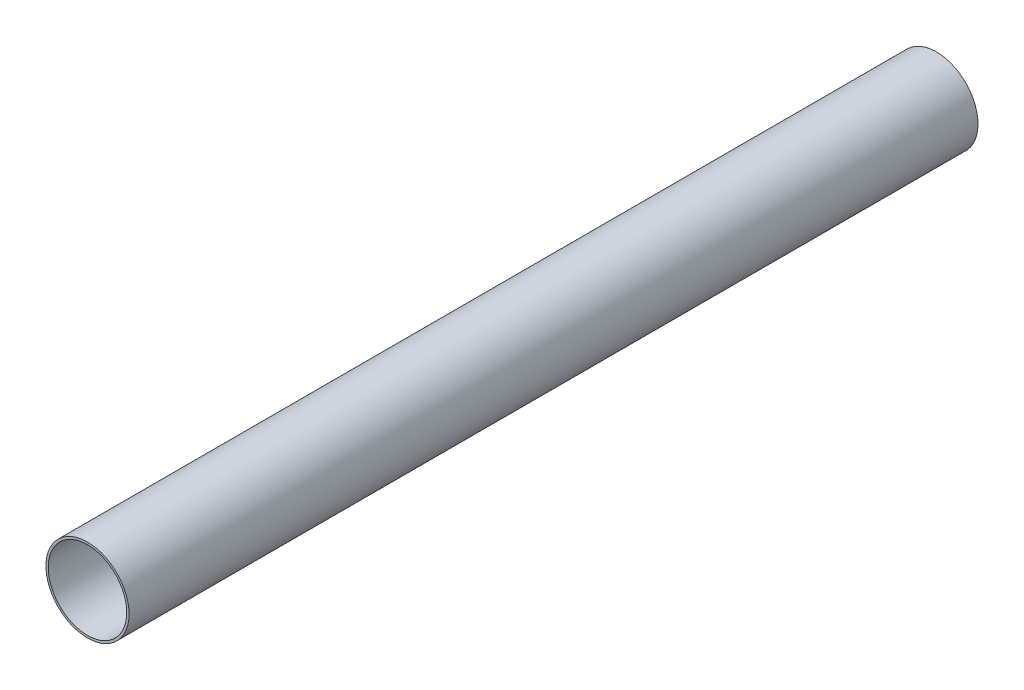
ISO-10303-21;
HEADER;
FILE_DESCRIPTION(('STEP AP214'),'2;1');
FILE_NAME('part.step','',(''),(''),'','','');
FILE_SCHEMA(('AUTOMOTIVE_DESIGN { 1 0 10303 214 1 1 1 1 }'));
ENDSEC;
DATA;
#1=APPLICATION_CONTEXT('core data for automotive mechanical design processes');
#2=APPLICATION_PROTOCOL_DEFINITION('international standard','automotive_design',2000,#1);
#3=PRODUCT_CONTEXT('',#1,'mechanical');
#4=PRODUCT('Part','Part','',(#3));
#5=PRODUCT_RELATED_PRODUCT_CATEGORY('part','',(#4));
#6=PRODUCT_DEFINITION_FORMATION('','',#4);
#7=PRODUCT_DEFINITION_CONTEXT('part definition',#1,'design');
#8=PRODUCT_DEFINITION('design','',#6,#7);
#9=PRODUCT_DEFINITION_SHAPE('','',#8);
#10=(LENGTH_UNIT() NAMED_UNIT(*) SI_UNIT(.MILLI.,.METRE.));
#11=(NAMED_UNIT(*) PLANE_ANGLE_UNIT() SI_UNIT($,.RADIAN.));
#12=(NAMED_UNIT(*) SI_UNIT($,.STERADIAN.) SOLID_ANGLE_UNIT());
#13=UNCERTAINTY_MEASURE_WITH_UNIT(LENGTH_MEASURE(1.E-05),#10,'distance_accuracy_value','');
#14=(GEOMETRIC_REPRESENTATION_CONTEXT(3) GLOBAL_UNCERTAINTY_ASSIGNED_CONTEXT((#13)) GLOBAL_UNIT_ASSIGNED_CONTEXT((#10,
#11,#12)) REPRESENTATION_CONTEXT('',''));
#15=CARTESIAN_POINT('',(0.,0.,0.));
#16=DIRECTION('',(0.,0.,1.));
#17=DIRECTION('',(1.,0.,0.));
#18=AXIS2_PLACEMENT_3D('',#15,#16,#17);
#19=CARTESIAN_POINT('',(0.,0.,-259.43));
#20=DIRECTION('',(0.,0.,1.));
#21=DIRECTION('',(1.,0.,0.));
#22=AXIS2_PLACEMENT_3D('',#19,#20,#21);
#23=CYLINDRICAL_SURFACE('',#22,12.7);
#24=CARTESIAN_POINT('',(0.,0.,-259.43));
#25=DIRECTION('',(0.,0.,1.));
#26=DIRECTION('',(1.,0.,0.));
#27=AXIS2_PLACEMENT_3D('',#24,#25,#26);
#28=CIRCLE('',#27,12.7);
#29=CARTESIAN_POINT('',(12.7,0.,-259.43));
#30=VERTEX_POINT('',#29);
#31=EDGE_CURVE('E10',#30,#30,#28,.T.);
#32=ORIENTED_EDGE('',*,*,#31,.T.);
#33=EDGE_LOOP('',(#32));
#34=FACE_BOUND('',#33,.T.);
#35=CARTESIAN_POINT('',(0.,0.,0.));
#36=DIRECTION('',(0.,0.,1.));
#37=DIRECTION('',(1.,0.,0.));
#38=AXIS2_PLACEMENT_3D('',#35,#36,#37);
#39=CIRCLE('',#38,12.7);
#40=CARTESIAN_POINT('',(12.7,0.,0.));
#41=VERTEX_POINT('',#40);
#42=EDGE_CURVE('E34',#41,#41,#39,.T.);
#43=ORIENTED_EDGE('',*,*,#42,.F.);
#44=EDGE_LOOP('',(#43));
#45=FACE_BOUND('',#44,.T.);
#46=ADVANCED_FACE('F31',(#34,#45),#23,.T.);
#47=CARTESIAN_POINT('',(0.,0.,-259.43));
#48=DIRECTION('',(0.,0.,1.));
#49=DIRECTION('',(1.,0.,0.));
#50=AXIS2_PLACEMENT_3D('',#47,#48,#49);
#51=PLANE('',#50);
#52=CARTESIAN_POINT('',(0.,0.,-259.43));
#53=DIRECTION('',(0.,0.,1.));
#54=DIRECTION('',(1.,0.,0.));
#55=AXIS2_PLACEMENT_3D('',#52,#53,#54);
#56=CIRCLE('',#55,12.);
#57=CARTESIAN_POINT('',(12.,0.,-259.43));
#58=VERTEX_POINT('',#57);
#59=EDGE_CURVE('E41',#58,#58,#56,.T.);
#60=ORIENTED_EDGE('',*,*,#59,.T.);
#61=EDGE_LOOP('',(#60));
#62=FACE_BOUND('',#61,.T.);
#63=ORIENTED_EDGE('',*,*,#31,.F.);
#64=EDGE_LOOP('',(#63));
#65=FACE_BOUND('',#64,.T.);
#66=ADVANCED_FACE('F49',(#62,#65),#51,.F.);
#67=CARTESIAN_POINT('',(0.,0.,0.));
#68=DIRECTION('',(0.,0.,1.));
#69=DIRECTION('',(1.,0.,0.));
#70=AXIS2_PLACEMENT_3D('',#67,#68,#69);
#71=PLANE('',#70);
#72=CARTESIAN_POINT('',(0.,0.,0.));
#73=DIRECTION('',(0.,0.,1.));
#74=DIRECTION('',(1.,0.,0.));
#75=AXIS2_PLACEMENT_3D('',#72,#73,#74);
#76=CIRCLE('',#75,12.);
#77=CARTESIAN_POINT('',(12.,0.,0.));
#78=VERTEX_POINT('',#77);
#79=EDGE_CURVE('E43',#78,#78,#76,.T.);
#80=ORIENTED_EDGE('',*,*,#79,.F.);
#81=EDGE_LOOP('',(#80));
#82=FACE_BOUND('',#81,.T.);
#83=ORIENTED_EDGE('',*,*,#42,.T.);
#84=EDGE_LOOP('',(#83));
#85=FACE_BOUND('',#84,.T.);
#86=ADVANCED_FACE('F55',(#82,#85),#71,.T.);
#87=CARTESIAN_POINT('',(0.,0.,-259.43));
#88=DIRECTION('',(0.,0.,1.));
#89=DIRECTION('',(1.,0.,0.));
#90=AXIS2_PLACEMENT_3D('',#87,#88,#89);
#91=CYLINDRICAL_SURFACE('',#90,12.);
#92=ORIENTED_EDGE('',*,*,#59,.F.);
#93=EDGE_LOOP('',(#92));
#94=FACE_BOUND('',#93,.T.);
#95=ORIENTED_EDGE('',*,*,#79,.T.);
#96=EDGE_LOOP('',(#95));
#97=FACE_BOUND('',#96,.T.);
#98=ADVANCED_FACE('F52',(#94,#97),#91,.F.);
#99=CLOSED_SHELL('',(#46,#66,#86,#98));
#100=MANIFOLD_SOLID_BREP('B2',#99);
#101=ADVANCED_BREP_SHAPE_REPRESENTATION('',(#18,#100),#14);
#102=SHAPE_DEFINITION_REPRESENTATION(#9,#101);
ENDSEC;
END-ISO-10303-21;
